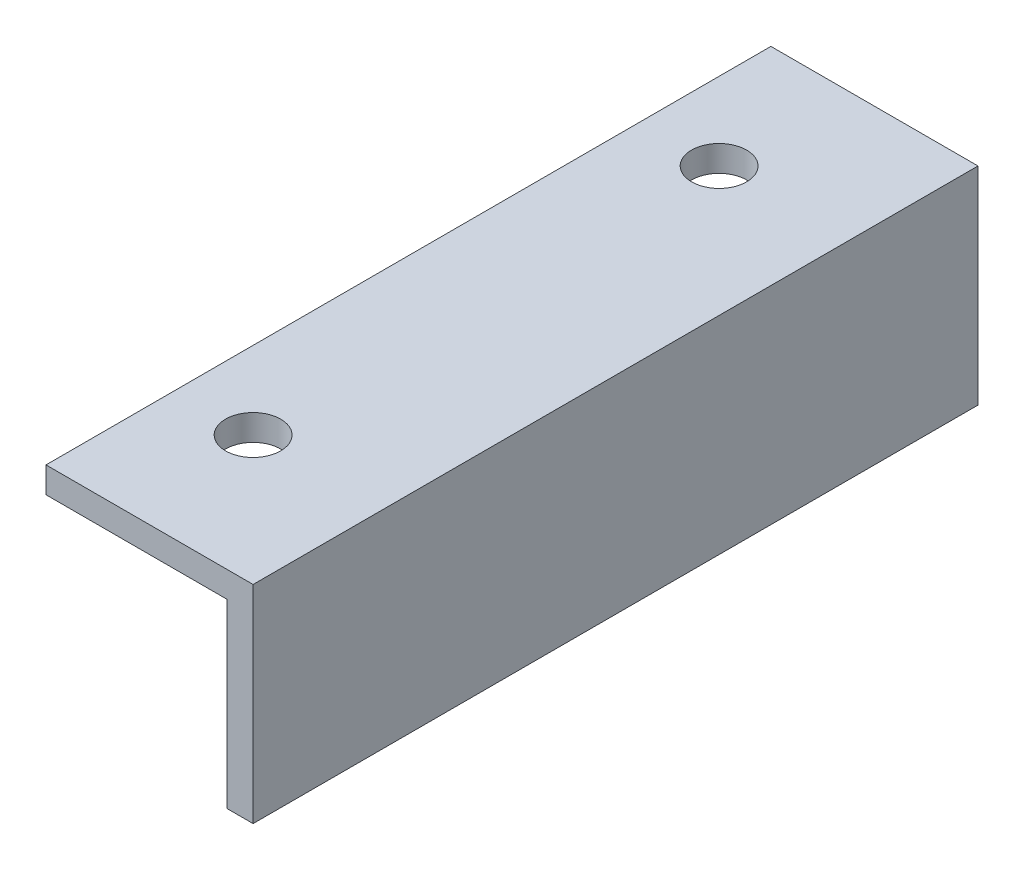
ISO-10303-21;
HEADER;
FILE_DESCRIPTION(('STEP AP214'),'2;1');
FILE_NAME('part.step','',(''),(''),'','','');
FILE_SCHEMA(('AUTOMOTIVE_DESIGN { 1 0 10303 214 1 1 1 1 }'));
ENDSEC;
DATA;
#1=APPLICATION_CONTEXT('core data for automotive mechanical design processes');
#2=APPLICATION_PROTOCOL_DEFINITION('international standard','automotive_design',2000,#1);
#3=PRODUCT_CONTEXT('',#1,'mechanical');
#4=PRODUCT('Part','Part','',(#3));
#5=PRODUCT_RELATED_PRODUCT_CATEGORY('part','',(#4));
#6=PRODUCT_DEFINITION_FORMATION('','',#4);
#7=PRODUCT_DEFINITION_CONTEXT('part definition',#1,'design');
#8=PRODUCT_DEFINITION('design','',#6,#7);
#9=PRODUCT_DEFINITION_SHAPE('','',#8);
#10=(LENGTH_UNIT() NAMED_UNIT(*) SI_UNIT(.MILLI.,.METRE.));
#11=(NAMED_UNIT(*) PLANE_ANGLE_UNIT() SI_UNIT($,.RADIAN.));
#12=(NAMED_UNIT(*) SI_UNIT($,.STERADIAN.) SOLID_ANGLE_UNIT());
#13=UNCERTAINTY_MEASURE_WITH_UNIT(LENGTH_MEASURE(1.E-05),#10,'distance_accuracy_value','');
#14=(GEOMETRIC_REPRESENTATION_CONTEXT(3) GLOBAL_UNCERTAINTY_ASSIGNED_CONTEXT((#13)) GLOBAL_UNIT_ASSIGNED_CONTEXT((#10,
#11,#12)) REPRESENTATION_CONTEXT('',''));
#15=CARTESIAN_POINT('',(0.,0.,0.));
#16=DIRECTION('',(0.,0.,1.));
#17=DIRECTION('',(1.,0.,0.));
#18=AXIS2_PLACEMENT_3D('',#15,#16,#17);
#19=CARTESIAN_POINT('',(-3.175,0.,88.9));
#20=DIRECTION('',(0.,1.,0.));
#21=DIRECTION('',(0.,0.,1.));
#22=AXIS2_PLACEMENT_3D('',#19,#20,#21);
#23=PLANE('',#22);
#24=DIRECTION('',(1.,0.,0.));
#25=VECTOR('',#24,1.);
#26=CARTESIAN_POINT('',(-3.175,0.,0.));
#27=LINE('',#26,#25);
#28=CARTESIAN_POINT('',(-3.175,0.,0.));
#29=VERTEX_POINT('',#28);
#30=CARTESIAN_POINT('',(0.,0.,0.));
#31=VERTEX_POINT('',#30);
#32=EDGE_CURVE('E125',#29,#31,#27,.T.);
#33=ORIENTED_EDGE('',*,*,#32,.T.);
#34=DIRECTION('',(0.,0.,-1.));
#35=VECTOR('',#34,1.);
#36=CARTESIAN_POINT('',(0.,0.,88.9));
#37=LINE('',#36,#35);
#38=CARTESIAN_POINT('',(0.,0.,88.9));
#39=VERTEX_POINT('',#38);
#40=EDGE_CURVE('E11',#39,#31,#37,.T.);
#41=ORIENTED_EDGE('',*,*,#40,.F.);
#42=DIRECTION('',(1.,0.,0.));
#43=VECTOR('',#42,1.);
#44=CARTESIAN_POINT('',(-3.175,0.,88.9));
#45=LINE('',#44,#43);
#46=CARTESIAN_POINT('',(-3.175,0.,88.9));
#47=VERTEX_POINT('',#46);
#48=EDGE_CURVE('E135',#47,#39,#45,.T.);
#49=ORIENTED_EDGE('',*,*,#48,.F.);
#50=DIRECTION('',(0.,0.,-1.));
#51=VECTOR('',#50,1.);
#52=CARTESIAN_POINT('',(-3.175,0.,88.9));
#53=LINE('',#52,#51);
#54=EDGE_CURVE('E121',#47,#29,#53,.T.);
#55=ORIENTED_EDGE('',*,*,#54,.T.);
#56=EDGE_LOOP('',(#33,#41,#49,#55));
#57=FACE_BOUND('',#56,.T.);
#58=ADVANCED_FACE('F39',(#57),#23,.F.);
#59=CARTESIAN_POINT('',(0.,0.,88.9));
#60=DIRECTION('',(-1.,0.,0.));
#61=DIRECTION('',(0.,0.,1.));
#62=AXIS2_PLACEMENT_3D('',#59,#60,#61);
#63=PLANE('',#62);
#64=DIRECTION('',(0.,1.,0.));
#65=VECTOR('',#64,1.);
#66=CARTESIAN_POINT('',(0.,0.,0.));
#67=LINE('',#66,#65);
#68=CARTESIAN_POINT('',(0.,25.4,0.));
#69=VERTEX_POINT('',#68);
#70=EDGE_CURVE('E128',#31,#69,#67,.T.);
#71=ORIENTED_EDGE('',*,*,#70,.T.);
#72=DIRECTION('',(0.,0.,-1.));
#73=VECTOR('',#72,1.);
#74=CARTESIAN_POINT('',(0.,25.4,88.9));
#75=LINE('',#74,#73);
#76=CARTESIAN_POINT('',(0.,25.4,88.9));
#77=VERTEX_POINT('',#76);
#78=EDGE_CURVE('E48',#77,#69,#75,.T.);
#79=ORIENTED_EDGE('',*,*,#78,.F.);
#80=DIRECTION('',(0.,1.,0.));
#81=VECTOR('',#80,1.);
#82=CARTESIAN_POINT('',(0.,0.,88.9));
#83=LINE('',#82,#81);
#84=EDGE_CURVE('E94',#39,#77,#83,.T.);
#85=ORIENTED_EDGE('',*,*,#84,.F.);
#86=ORIENTED_EDGE('',*,*,#40,.T.);
#87=EDGE_LOOP('',(#71,#79,#85,#86));
#88=FACE_BOUND('',#87,.T.);
#89=ADVANCED_FACE('F157',(#88),#63,.F.);
#90=CARTESIAN_POINT('',(0.,25.4,88.9));
#91=DIRECTION('',(0.,-1.,0.));
#92=DIRECTION('',(1.,0.,0.));
#93=AXIS2_PLACEMENT_3D('',#90,#91,#92);
#94=PLANE('',#93);
#95=CARTESIAN_POINT('',(-15.875,25.4,15.875));
#96=DIRECTION('',(0.,1.,0.));
#97=DIRECTION('',(-1.,0.,0.));
#98=AXIS2_PLACEMENT_3D('',#95,#96,#97);
#99=CIRCLE('',#98,3.3782);
#100=CARTESIAN_POINT('',(-19.2532,25.4,15.875));
#101=VERTEX_POINT('',#100);
#102=EDGE_CURVE('E142',#101,#101,#99,.T.);
#103=ORIENTED_EDGE('',*,*,#102,.F.);
#104=EDGE_LOOP('',(#103));
#105=FACE_BOUND('',#104,.T.);
#106=CARTESIAN_POINT('',(-15.875,25.4,73.025));
#107=DIRECTION('',(0.,1.,0.));
#108=DIRECTION('',(-1.,0.,0.));
#109=AXIS2_PLACEMENT_3D('',#106,#107,#108);
#110=CIRCLE('',#109,3.37819999999999);
#111=CARTESIAN_POINT('',(-19.2532,25.4,73.025));
#112=VERTEX_POINT('',#111);
#113=EDGE_CURVE('E147',#112,#112,#110,.T.);
#114=ORIENTED_EDGE('',*,*,#113,.F.);
#115=EDGE_LOOP('',(#114));
#116=FACE_BOUND('',#115,.T.);
#117=DIRECTION('',(-1.,0.,0.));
#118=VECTOR('',#117,1.);
#119=CARTESIAN_POINT('',(0.,25.4,0.));
#120=LINE('',#119,#118);
#121=CARTESIAN_POINT('',(-25.4,25.4,0.));
#122=VERTEX_POINT('',#121);
#123=EDGE_CURVE('E130',#69,#122,#120,.T.);
#124=ORIENTED_EDGE('',*,*,#123,.T.);
#125=DIRECTION('',(0.,0.,-1.));
#126=VECTOR('',#125,1.);
#127=CARTESIAN_POINT('',(-25.4,25.4,88.9));
#128=LINE('',#127,#126);
#129=CARTESIAN_POINT('',(-25.4,25.4,88.9));
#130=VERTEX_POINT('',#129);
#131=EDGE_CURVE('E116',#130,#122,#128,.T.);
#132=ORIENTED_EDGE('',*,*,#131,.F.);
#133=DIRECTION('',(-1.,0.,0.));
#134=VECTOR('',#133,1.);
#135=CARTESIAN_POINT('',(0.,25.4,88.9));
#136=LINE('',#135,#134);
#137=EDGE_CURVE('E107',#77,#130,#136,.T.);
#138=ORIENTED_EDGE('',*,*,#137,.F.);
#139=ORIENTED_EDGE('',*,*,#78,.T.);
#140=EDGE_LOOP('',(#124,#132,#138,#139));
#141=FACE_BOUND('',#140,.T.);
#142=ADVANCED_FACE('F160',(#105,#116,#141),#94,.F.);
#143=CARTESIAN_POINT('',(-25.4,25.4,88.9));
#144=DIRECTION('',(1.,0.,0.));
#145=DIRECTION('',(0.,0.,-1.));
#146=AXIS2_PLACEMENT_3D('',#143,#144,#145);
#147=PLANE('',#146);
#148=DIRECTION('',(0.,-1.,0.));
#149=VECTOR('',#148,1.);
#150=CARTESIAN_POINT('',(-25.4,25.4,0.));
#151=LINE('',#150,#149);
#152=CARTESIAN_POINT('',(-25.4,22.225,0.));
#153=VERTEX_POINT('',#152);
#154=EDGE_CURVE('E115',#122,#153,#151,.T.);
#155=ORIENTED_EDGE('',*,*,#154,.T.);
#156=DIRECTION('',(0.,0.,-1.));
#157=VECTOR('',#156,1.);
#158=CARTESIAN_POINT('',(-25.4,22.225,88.9));
#159=LINE('',#158,#157);
#160=CARTESIAN_POINT('',(-25.4,22.225,88.9));
#161=VERTEX_POINT('',#160);
#162=EDGE_CURVE('E112',#161,#153,#159,.T.);
#163=ORIENTED_EDGE('',*,*,#162,.F.);
#164=DIRECTION('',(0.,-1.,0.));
#165=VECTOR('',#164,1.);
#166=CARTESIAN_POINT('',(-25.4,25.4,88.9));
#167=LINE('',#166,#165);
#168=EDGE_CURVE('E101',#130,#161,#167,.T.);
#169=ORIENTED_EDGE('',*,*,#168,.F.);
#170=ORIENTED_EDGE('',*,*,#131,.T.);
#171=EDGE_LOOP('',(#155,#163,#169,#170));
#172=FACE_BOUND('',#171,.T.);
#173=ADVANCED_FACE('F113',(#172),#147,.F.);
#174=CARTESIAN_POINT('',(-25.4,22.225,88.9));
#175=DIRECTION('',(0.,1.,0.));
#176=DIRECTION('',(0.,0.,1.));
#177=AXIS2_PLACEMENT_3D('',#174,#175,#176);
#178=PLANE('',#177);
#179=CARTESIAN_POINT('',(-15.875,22.225,15.875));
#180=DIRECTION('',(0.,1.,0.));
#181=DIRECTION('',(0.,0.,1.));
#182=AXIS2_PLACEMENT_3D('',#179,#180,#181);
#183=CIRCLE('',#182,3.3782);
#184=CARTESIAN_POINT('',(-19.2532,22.225,15.875));
#185=VERTEX_POINT('',#184);
#186=EDGE_CURVE('E42',#185,#185,#183,.T.);
#187=ORIENTED_EDGE('',*,*,#186,.T.);
#188=EDGE_LOOP('',(#187));
#189=FACE_BOUND('',#188,.T.);
#190=CARTESIAN_POINT('',(-15.875,22.225,73.025));
#191=DIRECTION('',(0.,1.,0.));
#192=DIRECTION('',(0.,0.,1.));
#193=AXIS2_PLACEMENT_3D('',#190,#191,#192);
#194=CIRCLE('',#193,3.37819999999999);
#195=CARTESIAN_POINT('',(-19.2532,22.225,73.025));
#196=VERTEX_POINT('',#195);
#197=EDGE_CURVE('E140',#196,#196,#194,.T.);
#198=ORIENTED_EDGE('',*,*,#197,.T.);
#199=EDGE_LOOP('',(#198));
#200=FACE_BOUND('',#199,.T.);
#201=DIRECTION('',(1.,0.,0.));
#202=VECTOR('',#201,1.);
#203=CARTESIAN_POINT('',(-25.4,22.225,0.));
#204=LINE('',#203,#202);
#205=CARTESIAN_POINT('',(-3.175,22.225,0.));
#206=VERTEX_POINT('',#205);
#207=EDGE_CURVE('E80',#153,#206,#204,.T.);
#208=ORIENTED_EDGE('',*,*,#207,.T.);
#209=DIRECTION('',(0.,0.,-1.));
#210=VECTOR('',#209,1.);
#211=CARTESIAN_POINT('',(-3.175,22.225,88.9));
#212=LINE('',#211,#210);
#213=CARTESIAN_POINT('',(-3.175,22.225,88.9));
#214=VERTEX_POINT('',#213);
#215=EDGE_CURVE('E117',#214,#206,#212,.T.);
#216=ORIENTED_EDGE('',*,*,#215,.F.);
#217=DIRECTION('',(1.,0.,0.));
#218=VECTOR('',#217,1.);
#219=CARTESIAN_POINT('',(-25.4,22.225,88.9));
#220=LINE('',#219,#218);
#221=EDGE_CURVE('E105',#161,#214,#220,.T.);
#222=ORIENTED_EDGE('',*,*,#221,.F.);
#223=ORIENTED_EDGE('',*,*,#162,.T.);
#224=EDGE_LOOP('',(#208,#216,#222,#223));
#225=FACE_BOUND('',#224,.T.);
#226=ADVANCED_FACE('F119',(#189,#200,#225),#178,.F.);
#227=CARTESIAN_POINT('',(-3.175,22.225,88.9));
#228=DIRECTION('',(1.,0.,0.));
#229=DIRECTION('',(0.,0.,-1.));
#230=AXIS2_PLACEMENT_3D('',#227,#228,#229);
#231=PLANE('',#230);
#232=DIRECTION('',(0.,-1.,0.));
#233=VECTOR('',#232,1.);
#234=CARTESIAN_POINT('',(-3.175,22.225,0.));
#235=LINE('',#234,#233);
#236=EDGE_CURVE('E86',#206,#29,#235,.T.);
#237=ORIENTED_EDGE('',*,*,#236,.T.);
#238=ORIENTED_EDGE('',*,*,#54,.F.);
#239=DIRECTION('',(0.,-1.,0.));
#240=VECTOR('',#239,1.);
#241=CARTESIAN_POINT('',(-3.175,22.225,88.9));
#242=LINE('',#241,#240);
#243=EDGE_CURVE('E57',#214,#47,#242,.T.);
#244=ORIENTED_EDGE('',*,*,#243,.F.);
#245=ORIENTED_EDGE('',*,*,#215,.T.);
#246=EDGE_LOOP('',(#237,#238,#244,#245));
#247=FACE_BOUND('',#246,.T.);
#248=ADVANCED_FACE('F165',(#247),#231,.F.);
#249=CARTESIAN_POINT('',(0.,0.,88.9));
#250=DIRECTION('',(0.,0.,1.));
#251=DIRECTION('',(1.,0.,0.));
#252=AXIS2_PLACEMENT_3D('',#249,#250,#251);
#253=PLANE('',#252);
#254=ORIENTED_EDGE('',*,*,#48,.T.);
#255=ORIENTED_EDGE('',*,*,#84,.T.);
#256=ORIENTED_EDGE('',*,*,#137,.T.);
#257=ORIENTED_EDGE('',*,*,#168,.T.);
#258=ORIENTED_EDGE('',*,*,#221,.T.);
#259=ORIENTED_EDGE('',*,*,#243,.T.);
#260=EDGE_LOOP('',(#254,#255,#256,#257,#258,#259));
#261=FACE_BOUND('',#260,.T.);
#262=ADVANCED_FACE('F103',(#261),#253,.T.);
#263=CARTESIAN_POINT('',(0.,0.,0.));
#264=DIRECTION('',(0.,0.,1.));
#265=DIRECTION('',(1.,0.,0.));
#266=AXIS2_PLACEMENT_3D('',#263,#264,#265);
#267=PLANE('',#266);
#268=ORIENTED_EDGE('',*,*,#32,.F.);
#269=ORIENTED_EDGE('',*,*,#236,.F.);
#270=ORIENTED_EDGE('',*,*,#207,.F.);
#271=ORIENTED_EDGE('',*,*,#154,.F.);
#272=ORIENTED_EDGE('',*,*,#123,.F.);
#273=ORIENTED_EDGE('',*,*,#70,.F.);
#274=EDGE_LOOP('',(#268,#269,#270,#271,#272,#273));
#275=FACE_BOUND('',#274,.T.);
#276=ADVANCED_FACE('F163',(#275),#267,.F.);
#277=CARTESIAN_POINT('',(-15.875,0.,73.025));
#278=DIRECTION('',(0.,1.,0.));
#279=DIRECTION('',(-1.,0.,0.));
#280=AXIS2_PLACEMENT_3D('',#277,#278,#279);
#281=CYLINDRICAL_SURFACE('',#280,3.37819999999999);
#282=CARTESIAN_POINT('',(-19.2532,25.4,73.025));
#283=CARTESIAN_POINT('',(-19.2532,25.3669270833333,73.025));
#284=CARTESIAN_POINT('',(-19.2532,25.3338541666667,73.025));
#285=CARTESIAN_POINT('',(-19.2532,25.2677083333333,73.025));
#286=CARTESIAN_POINT('',(-19.2532,25.2346354166667,73.025));
#287=CARTESIAN_POINT('',(-19.2532,25.1684895833333,73.025));
#288=CARTESIAN_POINT('',(-19.2532,25.1354166666667,73.025));
#289=CARTESIAN_POINT('',(-19.2532,25.0692708333333,73.025));
#290=CARTESIAN_POINT('',(-19.2532,25.0361979166667,73.025));
#291=CARTESIAN_POINT('',(-19.2532,24.9700520833333,73.025));
#292=CARTESIAN_POINT('',(-19.2532,24.9369791666667,73.025));
#293=CARTESIAN_POINT('',(-19.2532,24.8708333333333,73.025));
#294=CARTESIAN_POINT('',(-19.2532,24.8377604166667,73.025));
#295=CARTESIAN_POINT('',(-19.2532,24.7716145833333,73.025));
#296=CARTESIAN_POINT('',(-19.2532,24.7385416666667,73.025));
#297=CARTESIAN_POINT('',(-19.2532,24.6723958333333,73.025));
#298=CARTESIAN_POINT('',(-19.2532,24.6393229166667,73.025));
#299=CARTESIAN_POINT('',(-19.2532,24.5731770833333,73.025));
#300=CARTESIAN_POINT('',(-19.2532,24.5401041666667,73.025));
#301=CARTESIAN_POINT('',(-19.2532,24.4739583333333,73.025));
#302=CARTESIAN_POINT('',(-19.2532,24.4408854166667,73.025));
#303=CARTESIAN_POINT('',(-19.2532,24.3747395833333,73.025));
#304=CARTESIAN_POINT('',(-19.2532,24.3416666666667,73.025));
#305=CARTESIAN_POINT('',(-19.2532,24.2755208333333,73.025));
#306=CARTESIAN_POINT('',(-19.2532,24.2424479166667,73.025));
#307=CARTESIAN_POINT('',(-19.2532,24.1763020833333,73.025));
#308=CARTESIAN_POINT('',(-19.2532,24.1432291666667,73.025));
#309=CARTESIAN_POINT('',(-19.2532,24.0770833333333,73.025));
#310=CARTESIAN_POINT('',(-19.2532,24.0440104166667,73.025));
#311=CARTESIAN_POINT('',(-19.2532,23.9778645833333,73.025));
#312=CARTESIAN_POINT('',(-19.2532,23.9447916666667,73.025));
#313=CARTESIAN_POINT('',(-19.2532,23.8786458333333,73.025));
#314=CARTESIAN_POINT('',(-19.2532,23.8455729166667,73.025));
#315=CARTESIAN_POINT('',(-19.2532,23.7794270833333,73.025));
#316=CARTESIAN_POINT('',(-19.2532,23.7463541666667,73.025));
#317=CARTESIAN_POINT('',(-19.2532,23.6802083333333,73.025));
#318=CARTESIAN_POINT('',(-19.2532,23.6471354166667,73.025));
#319=CARTESIAN_POINT('',(-19.2532,23.5809895833333,73.025));
#320=CARTESIAN_POINT('',(-19.2532,23.5479166666667,73.025));
#321=CARTESIAN_POINT('',(-19.2532,23.4817708333333,73.025));
#322=CARTESIAN_POINT('',(-19.2532,23.4486979166667,73.025));
#323=CARTESIAN_POINT('',(-19.2532,23.3825520833333,73.025));
#324=CARTESIAN_POINT('',(-19.2532,23.3494791666667,73.025));
#325=CARTESIAN_POINT('',(-19.2532,23.2833333333333,73.025));
#326=CARTESIAN_POINT('',(-19.2532,23.2502604166667,73.025));
#327=CARTESIAN_POINT('',(-19.2532,23.1841145833333,73.025));
#328=CARTESIAN_POINT('',(-19.2532,23.1510416666667,73.025));
#329=CARTESIAN_POINT('',(-19.2532,23.0848958333333,73.025));
#330=CARTESIAN_POINT('',(-19.2532,23.0518229166667,73.025));
#331=CARTESIAN_POINT('',(-19.2532,22.9856770833333,73.025));
#332=CARTESIAN_POINT('',(-19.2532,22.9526041666667,73.025));
#333=CARTESIAN_POINT('',(-19.2532,22.8864583333333,73.025));
#334=CARTESIAN_POINT('',(-19.2532,22.8533854166667,73.025));
#335=CARTESIAN_POINT('',(-19.2532,22.7872395833333,73.025));
#336=CARTESIAN_POINT('',(-19.2532,22.7541666666667,73.025));
#337=CARTESIAN_POINT('',(-19.2532,22.6880208333333,73.025));
#338=CARTESIAN_POINT('',(-19.2532,22.6549479166667,73.025));
#339=CARTESIAN_POINT('',(-19.2532,22.5888020833333,73.025));
#340=CARTESIAN_POINT('',(-19.2532,22.5557291666667,73.025));
#341=CARTESIAN_POINT('',(-19.2532,22.4895833333333,73.025));
#342=CARTESIAN_POINT('',(-19.2532,22.4565104166667,73.025));
#343=CARTESIAN_POINT('',(-19.2532,22.3903645833333,73.025));
#344=CARTESIAN_POINT('',(-19.2532,22.3572916666667,73.025));
#345=CARTESIAN_POINT('',(-19.2532,22.2911458333333,73.025));
#346=CARTESIAN_POINT('',(-19.2532,22.2580729166667,73.025));
#347=CARTESIAN_POINT('',(-19.2532,22.225,73.025));
#348=B_SPLINE_CURVE_WITH_KNOTS('',3,(#282,#283,#284,#285,#286,#287,#288,#289,#290,#291,#292,
#293,#294,#295,#296,#297,#298,#299,#300,#301,#302,#303,#304,#305,#306,#307,#308,#309,#310,#311,
#312,#313,#314,#315,#316,#317,#318,#319,#320,#321,#322,#323,#324,#325,#326,#327,#328,#329,#330,
#331,#332,#333,#334,#335,#336,#337,#338,#339,#340,#341,#342,#343,#344,#345,#346,#347),
.UNSPECIFIED.,.F.,.F.,(4,2,2,2,2,2,2,2,2,2,2,2,2,2,2,2,2,2,2,2,2,2,2,2,2,2,2,2,2,2,2,2,4),(0.,
0.0992187500000012,0.198437499999999,0.29765625,0.396874999999998,0.496093749999999,0.5953125,
0.694531249999998,0.793749999999999,0.892968750000001,0.992187499999998,1.09140625,1.190625,
1.28984375,1.3890625,1.48828125,1.5875,1.68671875,1.7859375,1.88515625,1.984375,2.08359375,
2.1828125,2.28203125,2.38125,2.48046875,2.5796875,2.67890625,2.778125,2.87734375,2.9765625,
3.07578125,3.175),.UNSPECIFIED.);
#349=EDGE_CURVE('BSEAM205',#112,#196,#348,.T.);
#350=ORIENTED_EDGE('',*,*,#113,.T.);
#351=ORIENTED_EDGE('',*,*,#197,.F.);
#352=ORIENTED_EDGE('',*,*,#349,.T.);
#353=ORIENTED_EDGE('',*,*,#349,.F.);
#354=EDGE_LOOP('',(#350,#352,#351,#353));
#355=FACE_BOUND('',#354,.T.);
#356=ADVANCED_FACE('F205',(#355),#281,.F.);
#357=CARTESIAN_POINT('',(-15.875,0.,15.875));
#358=DIRECTION('',(0.,1.,0.));
#359=DIRECTION('',(-1.,0.,0.));
#360=AXIS2_PLACEMENT_3D('',#357,#358,#359);
#361=CYLINDRICAL_SURFACE('',#360,3.3782);
#362=CARTESIAN_POINT('',(-19.2532,25.4,15.875));
#363=CARTESIAN_POINT('',(-19.2532,25.3669270833333,15.875));
#364=CARTESIAN_POINT('',(-19.2532,25.3338541666667,15.875));
#365=CARTESIAN_POINT('',(-19.2532,25.2677083333333,15.875));
#366=CARTESIAN_POINT('',(-19.2532,25.2346354166667,15.875));
#367=CARTESIAN_POINT('',(-19.2532,25.1684895833333,15.875));
#368=CARTESIAN_POINT('',(-19.2532,25.1354166666667,15.875));
#369=CARTESIAN_POINT('',(-19.2532,25.0692708333333,15.875));
#370=CARTESIAN_POINT('',(-19.2532,25.0361979166667,15.875));
#371=CARTESIAN_POINT('',(-19.2532,24.9700520833333,15.875));
#372=CARTESIAN_POINT('',(-19.2532,24.9369791666667,15.875));
#373=CARTESIAN_POINT('',(-19.2532,24.8708333333333,15.875));
#374=CARTESIAN_POINT('',(-19.2532,24.8377604166667,15.875));
#375=CARTESIAN_POINT('',(-19.2532,24.7716145833333,15.875));
#376=CARTESIAN_POINT('',(-19.2532,24.7385416666667,15.875));
#377=CARTESIAN_POINT('',(-19.2532,24.6723958333333,15.875));
#378=CARTESIAN_POINT('',(-19.2532,24.6393229166667,15.875));
#379=CARTESIAN_POINT('',(-19.2532,24.5731770833333,15.875));
#380=CARTESIAN_POINT('',(-19.2532,24.5401041666667,15.875));
#381=CARTESIAN_POINT('',(-19.2532,24.4739583333333,15.875));
#382=CARTESIAN_POINT('',(-19.2532,24.4408854166667,15.875));
#383=CARTESIAN_POINT('',(-19.2532,24.3747395833333,15.875));
#384=CARTESIAN_POINT('',(-19.2532,24.3416666666667,15.875));
#385=CARTESIAN_POINT('',(-19.2532,24.2755208333333,15.875));
#386=CARTESIAN_POINT('',(-19.2532,24.2424479166667,15.875));
#387=CARTESIAN_POINT('',(-19.2532,24.1763020833333,15.875));
#388=CARTESIAN_POINT('',(-19.2532,24.1432291666667,15.875));
#389=CARTESIAN_POINT('',(-19.2532,24.0770833333333,15.875));
#390=CARTESIAN_POINT('',(-19.2532,24.0440104166667,15.875));
#391=CARTESIAN_POINT('',(-19.2532,23.9778645833333,15.875));
#392=CARTESIAN_POINT('',(-19.2532,23.9447916666667,15.875));
#393=CARTESIAN_POINT('',(-19.2532,23.8786458333333,15.875));
#394=CARTESIAN_POINT('',(-19.2532,23.8455729166667,15.875));
#395=CARTESIAN_POINT('',(-19.2532,23.7794270833333,15.875));
#396=CARTESIAN_POINT('',(-19.2532,23.7463541666667,15.875));
#397=CARTESIAN_POINT('',(-19.2532,23.6802083333333,15.875));
#398=CARTESIAN_POINT('',(-19.2532,23.6471354166667,15.875));
#399=CARTESIAN_POINT('',(-19.2532,23.5809895833333,15.875));
#400=CARTESIAN_POINT('',(-19.2532,23.5479166666667,15.875));
#401=CARTESIAN_POINT('',(-19.2532,23.4817708333333,15.875));
#402=CARTESIAN_POINT('',(-19.2532,23.4486979166667,15.875));
#403=CARTESIAN_POINT('',(-19.2532,23.3825520833333,15.875));
#404=CARTESIAN_POINT('',(-19.2532,23.3494791666667,15.875));
#405=CARTESIAN_POINT('',(-19.2532,23.2833333333333,15.875));
#406=CARTESIAN_POINT('',(-19.2532,23.2502604166667,15.875));
#407=CARTESIAN_POINT('',(-19.2532,23.1841145833333,15.875));
#408=CARTESIAN_POINT('',(-19.2532,23.1510416666667,15.875));
#409=CARTESIAN_POINT('',(-19.2532,23.0848958333333,15.875));
#410=CARTESIAN_POINT('',(-19.2532,23.0518229166667,15.875));
#411=CARTESIAN_POINT('',(-19.2532,22.9856770833333,15.875));
#412=CARTESIAN_POINT('',(-19.2532,22.9526041666667,15.875));
#413=CARTESIAN_POINT('',(-19.2532,22.8864583333333,15.875));
#414=CARTESIAN_POINT('',(-19.2532,22.8533854166667,15.875));
#415=CARTESIAN_POINT('',(-19.2532,22.7872395833333,15.875));
#416=CARTESIAN_POINT('',(-19.2532,22.7541666666667,15.875));
#417=CARTESIAN_POINT('',(-19.2532,22.6880208333333,15.875));
#418=CARTESIAN_POINT('',(-19.2532,22.6549479166667,15.875));
#419=CARTESIAN_POINT('',(-19.2532,22.5888020833333,15.875));
#420=CARTESIAN_POINT('',(-19.2532,22.5557291666667,15.875));
#421=CARTESIAN_POINT('',(-19.2532,22.4895833333333,15.875));
#422=CARTESIAN_POINT('',(-19.2532,22.4565104166667,15.875));
#423=CARTESIAN_POINT('',(-19.2532,22.3903645833333,15.875));
#424=CARTESIAN_POINT('',(-19.2532,22.3572916666667,15.875));
#425=CARTESIAN_POINT('',(-19.2532,22.2911458333333,15.875));
#426=CARTESIAN_POINT('',(-19.2532,22.2580729166667,15.875));
#427=CARTESIAN_POINT('',(-19.2532,22.225,15.875));
#428=B_SPLINE_CURVE_WITH_KNOTS('',3,(#362,#363,#364,#365,#366,#367,#368,#369,#370,#371,#372,
#373,#374,#375,#376,#377,#378,#379,#380,#381,#382,#383,#384,#385,#386,#387,#388,#389,#390,#391,
#392,#393,#394,#395,#396,#397,#398,#399,#400,#401,#402,#403,#404,#405,#406,#407,#408,#409,#410,
#411,#412,#413,#414,#415,#416,#417,#418,#419,#420,#421,#422,#423,#424,#425,#426,#427),
.UNSPECIFIED.,.F.,.F.,(4,2,2,2,2,2,2,2,2,2,2,2,2,2,2,2,2,2,2,2,2,2,2,2,2,2,2,2,2,2,2,2,4),(0.,
0.0992187500000012,0.198437499999999,0.29765625,0.396874999999998,0.496093749999999,0.5953125,
0.694531249999998,0.793749999999999,0.892968750000001,0.992187499999998,1.09140625,1.190625,
1.28984375,1.3890625,1.48828125,1.5875,1.68671875,1.7859375,1.88515625,1.984375,2.08359375,
2.1828125,2.28203125,2.38125,2.48046875,2.5796875,2.67890625,2.778125,2.87734375,2.9765625,
3.07578125,3.175),.UNSPECIFIED.);
#429=EDGE_CURVE('BSEAM210',#101,#185,#428,.T.);
#430=ORIENTED_EDGE('',*,*,#102,.T.);
#431=ORIENTED_EDGE('',*,*,#186,.F.);
#432=ORIENTED_EDGE('',*,*,#429,.T.);
#433=ORIENTED_EDGE('',*,*,#429,.F.);
#434=EDGE_LOOP('',(#430,#432,#431,#433));
#435=FACE_BOUND('',#434,.T.);
#436=ADVANCED_FACE('F210',(#435),#361,.F.);
#437=CLOSED_SHELL('',(#58,#89,#142,#173,#226,#248,#262,#276,#356,#436));
#438=MANIFOLD_SOLID_BREP('B2',#437);
#439=ADVANCED_BREP_SHAPE_REPRESENTATION('',(#18,#438),#14);
#440=SHAPE_DEFINITION_REPRESENTATION(#9,#439);
ENDSEC;
END-ISO-10303-21;
